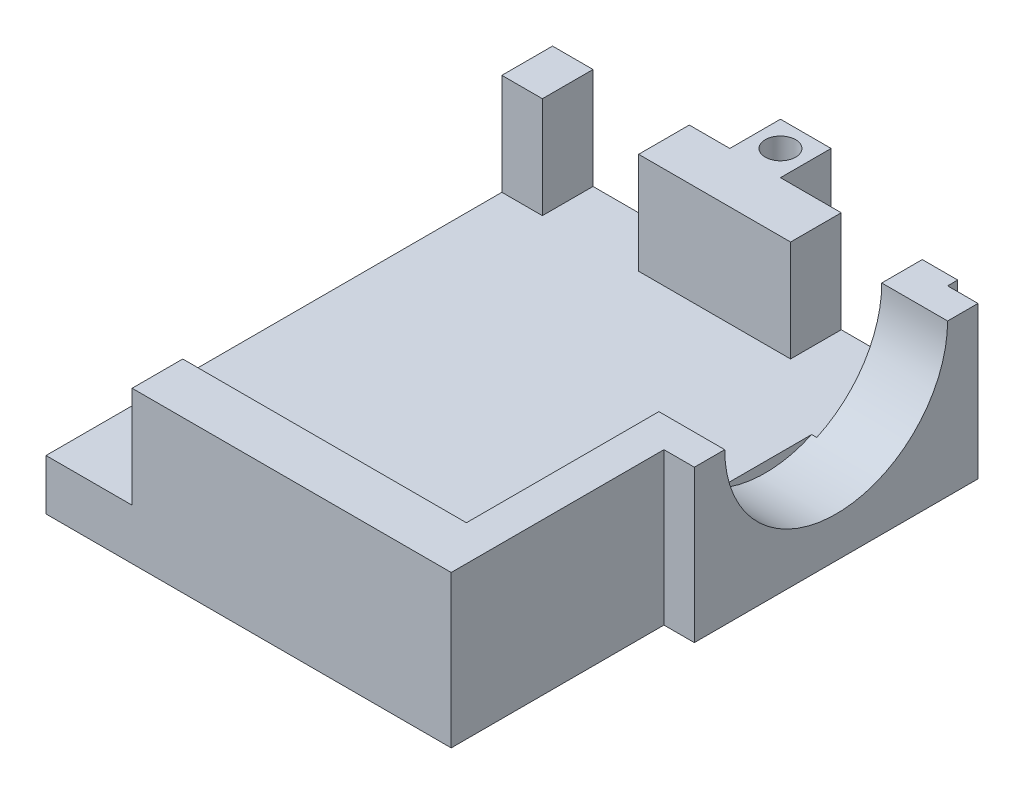
ISO-10303-21;
HEADER;
FILE_DESCRIPTION(('STEP AP214'),'2;1');
FILE_NAME('part.step','',(''),(''),'','','');
FILE_SCHEMA(('AUTOMOTIVE_DESIGN { 1 0 10303 214 1 1 1 1 }'));
ENDSEC;
DATA;
#1=APPLICATION_CONTEXT('core data for automotive mechanical design processes');
#2=APPLICATION_PROTOCOL_DEFINITION('international standard','automotive_design',2000,#1);
#3=PRODUCT_CONTEXT('',#1,'mechanical');
#4=PRODUCT('Part','Part','',(#3));
#5=PRODUCT_RELATED_PRODUCT_CATEGORY('part','',(#4));
#6=PRODUCT_DEFINITION_FORMATION('','',#4);
#7=PRODUCT_DEFINITION_CONTEXT('part definition',#1,'design');
#8=PRODUCT_DEFINITION('design','',#6,#7);
#9=PRODUCT_DEFINITION_SHAPE('','',#8);
#10=(LENGTH_UNIT() NAMED_UNIT(*) SI_UNIT(.MILLI.,.METRE.));
#11=(NAMED_UNIT(*) PLANE_ANGLE_UNIT() SI_UNIT($,.RADIAN.));
#12=(NAMED_UNIT(*) SI_UNIT($,.STERADIAN.) SOLID_ANGLE_UNIT());
#13=UNCERTAINTY_MEASURE_WITH_UNIT(LENGTH_MEASURE(1.E-05),#10,'distance_accuracy_value','');
#14=(GEOMETRIC_REPRESENTATION_CONTEXT(3) GLOBAL_UNCERTAINTY_ASSIGNED_CONTEXT((#13)) GLOBAL_UNIT_ASSIGNED_CONTEXT((#10,
#11,#12)) REPRESENTATION_CONTEXT('',''));
#15=CARTESIAN_POINT('',(0.,0.,0.));
#16=DIRECTION('',(0.,0.,1.));
#17=DIRECTION('',(1.,0.,0.));
#18=AXIS2_PLACEMENT_3D('',#15,#16,#17);
#19=CARTESIAN_POINT('',(-20.,5.,-25.));
#20=DIRECTION('',(0.,0.,1.));
#21=DIRECTION('',(1.,0.,0.));
#22=AXIS2_PLACEMENT_3D('',#19,#20,#21);
#23=PLANE('',#22);
#24=DIRECTION('',(0.,1.,0.));
#25=VECTOR('',#24,1.);
#26=CARTESIAN_POINT('',(-2.5,10.,-25.));
#27=LINE('',#26,#25);
#28=CARTESIAN_POINT('',(-2.5,10.,-25.));
#29=VERTEX_POINT('',#28);
#30=CARTESIAN_POINT('',(-2.5,15.,-25.));
#31=VERTEX_POINT('',#30);
#32=EDGE_CURVE('E116',#29,#31,#27,.T.);
#33=ORIENTED_EDGE('',*,*,#32,.F.);
#34=DIRECTION('',(-1.,0.,0.));
#35=VECTOR('',#34,1.);
#36=CARTESIAN_POINT('',(-2.5,10.,-25.));
#37=LINE('',#36,#35);
#38=CARTESIAN_POINT('',(2.5,10.,-25.));
#39=VERTEX_POINT('',#38);
#40=EDGE_CURVE('E299',#39,#29,#37,.T.);
#41=ORIENTED_EDGE('',*,*,#40,.F.);
#42=DIRECTION('',(0.,-1.,0.));
#43=VECTOR('',#42,1.);
#44=CARTESIAN_POINT('',(2.5,10.,-25.));
#45=LINE('',#44,#43);
#46=CARTESIAN_POINT('',(2.5,15.,-25.));
#47=VERTEX_POINT('',#46);
#48=EDGE_CURVE('E646',#47,#39,#45,.T.);
#49=ORIENTED_EDGE('',*,*,#48,.F.);
#50=DIRECTION('',(-1.,0.,0.));
#51=VECTOR('',#50,1.);
#52=CARTESIAN_POINT('',(0.,15.,-25.));
#53=LINE('',#52,#51);
#54=CARTESIAN_POINT('',(8.5,15.,-25.));
#55=VERTEX_POINT('',#54);
#56=EDGE_CURVE('E411',#55,#47,#53,.T.);
#57=ORIENTED_EDGE('',*,*,#56,.F.);
#58=DIRECTION('',(0.,-1.,0.));
#59=VECTOR('',#58,1.);
#60=CARTESIAN_POINT('',(8.5,15.,-25.));
#61=LINE('',#60,#59);
#62=CARTESIAN_POINT('',(8.5,5.,-25.));
#63=VERTEX_POINT('',#62);
#64=EDGE_CURVE('E365',#55,#63,#61,.T.);
#65=ORIENTED_EDGE('',*,*,#64,.T.);
#66=DIRECTION('',(-1.,0.,0.));
#67=VECTOR('',#66,1.);
#68=CARTESIAN_POINT('',(-20.,5.,-25.));
#69=LINE('',#68,#67);
#70=CARTESIAN_POINT('',(16.5,5.,-25.));
#71=VERTEX_POINT('',#70);
#72=EDGE_CURVE('E445',#71,#63,#69,.T.);
#73=ORIENTED_EDGE('',*,*,#72,.F.);
#74=DIRECTION('',(0.,-1.,0.));
#75=VECTOR('',#74,1.);
#76=CARTESIAN_POINT('',(16.5,15.,-25.));
#77=LINE('',#76,#75);
#78=CARTESIAN_POINT('',(16.5,15.,-25.));
#79=VERTEX_POINT('',#78);
#80=EDGE_CURVE('E351',#79,#71,#77,.T.);
#81=ORIENTED_EDGE('',*,*,#80,.F.);
#82=DIRECTION('',(-1.,0.,0.));
#83=VECTOR('',#82,1.);
#84=CARTESIAN_POINT('',(0.,15.,-25.));
#85=LINE('',#84,#83);
#86=CARTESIAN_POINT('',(20.,15.,-25.));
#87=VERTEX_POINT('',#86);
#88=EDGE_CURVE('E382',#87,#79,#85,.T.);
#89=ORIENTED_EDGE('',*,*,#88,.F.);
#90=DIRECTION('',(0.,-1.,0.));
#91=VECTOR('',#90,1.);
#92=CARTESIAN_POINT('',(20.,5.,-25.));
#93=LINE('',#92,#91);
#94=CARTESIAN_POINT('',(20.,0.,-25.));
#95=VERTEX_POINT('',#94);
#96=EDGE_CURVE('E458',#87,#95,#93,.T.);
#97=ORIENTED_EDGE('',*,*,#96,.T.);
#98=DIRECTION('',(-1.,0.,0.));
#99=VECTOR('',#98,1.);
#100=CARTESIAN_POINT('',(-20.,0.,-25.));
#101=LINE('',#100,#99);
#102=CARTESIAN_POINT('',(-20.,0.,-25.));
#103=VERTEX_POINT('',#102);
#104=EDGE_CURVE('E441',#95,#103,#101,.T.);
#105=ORIENTED_EDGE('',*,*,#104,.T.);
#106=DIRECTION('',(0.,-1.,0.));
#107=VECTOR('',#106,1.);
#108=CARTESIAN_POINT('',(-20.,5.,-25.));
#109=LINE('',#108,#107);
#110=CARTESIAN_POINT('',(-20.,15.,-25.));
#111=VERTEX_POINT('',#110);
#112=EDGE_CURVE('E447',#111,#103,#109,.T.);
#113=ORIENTED_EDGE('',*,*,#112,.F.);
#114=DIRECTION('',(1.,0.,0.));
#115=VECTOR('',#114,1.);
#116=CARTESIAN_POINT('',(-20.,15.,-25.));
#117=LINE('',#116,#115);
#118=CARTESIAN_POINT('',(-16.,15.,-25.));
#119=VERTEX_POINT('',#118);
#120=EDGE_CURVE('E421',#111,#119,#117,.T.);
#121=ORIENTED_EDGE('',*,*,#120,.T.);
#122=DIRECTION('',(0.,-1.,0.));
#123=VECTOR('',#122,1.);
#124=CARTESIAN_POINT('',(-16.,15.,-25.));
#125=LINE('',#124,#123);
#126=CARTESIAN_POINT('',(-16.,5.,-25.));
#127=VERTEX_POINT('',#126);
#128=EDGE_CURVE('E431',#119,#127,#125,.T.);
#129=ORIENTED_EDGE('',*,*,#128,.T.);
#130=CARTESIAN_POINT('',(-6.5,5.,-25.));
#131=VERTEX_POINT('',#130);
#132=EDGE_CURVE('E444',#131,#127,#69,.T.);
#133=ORIENTED_EDGE('',*,*,#132,.F.);
#134=DIRECTION('',(0.,-1.,0.));
#135=VECTOR('',#134,1.);
#136=CARTESIAN_POINT('',(-6.5,15.,-25.));
#137=LINE('',#136,#135);
#138=CARTESIAN_POINT('',(-6.5,15.,-25.));
#139=VERTEX_POINT('',#138);
#140=EDGE_CURVE('E390',#139,#131,#137,.T.);
#141=ORIENTED_EDGE('',*,*,#140,.F.);
#142=EDGE_CURVE('E121',#31,#139,#53,.T.);
#143=ORIENTED_EDGE('',*,*,#142,.F.);
#144=EDGE_LOOP('',(#33,#41,#49,#57,#65,#73,#81,#89,#97,#105,#113,#121,#129,#133,#141,#143));
#145=FACE_BOUND('',#144,.T.);
#146=ADVANCED_FACE('F101',(#145),#23,.F.);
#147=CARTESIAN_POINT('',(20.,5.,-25.));
#148=DIRECTION('',(-1.,0.,0.));
#149=DIRECTION('',(0.,0.,1.));
#150=AXIS2_PLACEMENT_3D('',#147,#148,#149);
#151=PLANE('',#150);
#152=DIRECTION('',(0.,-1.,0.));
#153=VECTOR('',#152,1.);
#154=CARTESIAN_POINT('',(20.,15.,4.00000000000002));
#155=LINE('',#154,#153);
#156=CARTESIAN_POINT('',(20.,15.,4.00000000000002));
#157=VERTEX_POINT('',#156);
#158=CARTESIAN_POINT('',(20.,0.,4.00000000000002));
#159=VERTEX_POINT('',#158);
#160=EDGE_CURVE('E305',#157,#159,#155,.T.);
#161=ORIENTED_EDGE('',*,*,#160,.F.);
#162=DIRECTION('',(0.,0.,-1.));
#163=VECTOR('',#162,1.);
#164=CARTESIAN_POINT('',(20.,15.,0.));
#165=LINE('',#164,#163);
#166=CARTESIAN_POINT('',(20.,15.,25.));
#167=VERTEX_POINT('',#166);
#168=EDGE_CURVE('E385',#167,#157,#165,.T.);
#169=ORIENTED_EDGE('',*,*,#168,.F.);
#170=DIRECTION('',(0.,-1.,0.));
#171=VECTOR('',#170,1.);
#172=CARTESIAN_POINT('',(20.,5.,25.));
#173=LINE('',#172,#171);
#174=CARTESIAN_POINT('',(20.,0.,25.));
#175=VERTEX_POINT('',#174);
#176=EDGE_CURVE('E461',#167,#175,#173,.T.);
#177=ORIENTED_EDGE('',*,*,#176,.T.);
#178=DIRECTION('',(0.,0.,-1.));
#179=VECTOR('',#178,1.);
#180=CARTESIAN_POINT('',(20.,0.,-25.));
#181=LINE('',#180,#179);
#182=EDGE_CURVE('E453',#175,#159,#181,.T.);
#183=ORIENTED_EDGE('',*,*,#182,.T.);
#184=EDGE_LOOP('',(#161,#169,#177,#183));
#185=FACE_BOUND('',#184,.T.);
#186=ADVANCED_FACE('F558',(#185),#151,.F.);
#187=DIRECTION('',(0.,1.,0.));
#188=VECTOR('',#187,1.);
#189=CARTESIAN_POINT('',(20.,0.,-24.));
#190=LINE('',#189,#188);
#191=CARTESIAN_POINT('',(20.,0.,-24.));
#192=VERTEX_POINT('',#191);
#193=CARTESIAN_POINT('',(20.,15.,-24.));
#194=VERTEX_POINT('',#193);
#195=EDGE_CURVE('E302',#192,#194,#190,.T.);
#196=ORIENTED_EDGE('',*,*,#195,.F.);
#197=EDGE_CURVE('E452',#192,#95,#181,.T.);
#198=ORIENTED_EDGE('',*,*,#197,.T.);
#199=ORIENTED_EDGE('',*,*,#96,.F.);
#200=EDGE_CURVE('E384',#194,#87,#165,.T.);
#201=ORIENTED_EDGE('',*,*,#200,.F.);
#202=EDGE_LOOP('',(#196,#198,#199,#201));
#203=FACE_BOUND('',#202,.T.);
#204=ADVANCED_FACE('F562',(#203),#151,.F.);
#205=CARTESIAN_POINT('',(16.5,15.,0.));
#206=DIRECTION('',(1.,0.,0.));
#207=DIRECTION('',(0.,0.,-1.));
#208=AXIS2_PLACEMENT_3D('',#205,#206,#207);
#209=PLANE('',#208);
#210=DIRECTION('',(0.,0.,1.));
#211=VECTOR('',#210,1.);
#212=CARTESIAN_POINT('',(16.5,15.,0.));
#213=LINE('',#212,#211);
#214=CARTESIAN_POINT('',(16.5,15.,1.00000000000002));
#215=VERTEX_POINT('',#214);
#216=CARTESIAN_POINT('',(16.5,15.,20.));
#217=VERTEX_POINT('',#216);
#218=EDGE_CURVE('E375',#215,#217,#213,.T.);
#219=ORIENTED_EDGE('',*,*,#218,.F.);
#220=CARTESIAN_POINT('',(16.5,15.,-9.99999999999998));
#221=DIRECTION('',(1.,0.,0.));
#222=DIRECTION('',(0.,0.,-1.));
#223=AXIS2_PLACEMENT_3D('',#220,#221,#222);
#224=CIRCLE('',#223,11.);
#225=CARTESIAN_POINT('',(16.5,5.,-5.41742430504414));
#226=VERTEX_POINT('',#225);
#227=EDGE_CURVE('E347',#215,#226,#224,.T.);
#228=ORIENTED_EDGE('',*,*,#227,.T.);
#229=DIRECTION('',(0.,0.,1.));
#230=VECTOR('',#229,1.);
#231=CARTESIAN_POINT('',(16.5,5.,0.));
#232=LINE('',#231,#230);
#233=CARTESIAN_POINT('',(16.5,5.,20.));
#234=VERTEX_POINT('',#233);
#235=EDGE_CURVE('E378',#226,#234,#232,.T.);
#236=ORIENTED_EDGE('',*,*,#235,.T.);
#237=DIRECTION('',(0.,-1.,0.));
#238=VECTOR('',#237,1.);
#239=CARTESIAN_POINT('',(16.5,15.,20.));
#240=LINE('',#239,#238);
#241=EDGE_CURVE('E372',#217,#234,#240,.T.);
#242=ORIENTED_EDGE('',*,*,#241,.F.);
#243=EDGE_LOOP('',(#219,#228,#236,#242));
#244=FACE_BOUND('',#243,.T.);
#245=ADVANCED_FACE('F556',(#244),#209,.F.);
#246=CARTESIAN_POINT('',(0.,15.,0.));
#247=DIRECTION('',(0.,1.,0.));
#248=DIRECTION('',(0.,0.,1.));
#249=AXIS2_PLACEMENT_3D('',#246,#247,#248);
#250=PLANE('',#249);
#251=DIRECTION('',(1.,0.,0.));
#252=VECTOR('',#251,1.);
#253=CARTESIAN_POINT('',(16.,15.,1.00000000000002));
#254=LINE('',#253,#252);
#255=CARTESIAN_POINT('',(23.,15.,1.00000000000003));
#256=VERTEX_POINT('',#255);
#257=EDGE_CURVE('E109',#215,#256,#254,.T.);
#258=ORIENTED_EDGE('',*,*,#257,.F.);
#259=ORIENTED_EDGE('',*,*,#218,.T.);
#260=DIRECTION('',(-1.,0.,0.));
#261=VECTOR('',#260,1.);
#262=CARTESIAN_POINT('',(-6.49999999999999,15.,20.));
#263=LINE('',#262,#261);
#264=CARTESIAN_POINT('',(-11.5,15.,20.));
#265=VERTEX_POINT('',#264);
#266=EDGE_CURVE('E354',#217,#265,#263,.T.);
#267=ORIENTED_EDGE('',*,*,#266,.T.);
#268=DIRECTION('',(0.,0.,1.));
#269=VECTOR('',#268,1.);
#270=CARTESIAN_POINT('',(-11.5,15.,20.));
#271=LINE('',#270,#269);
#272=CARTESIAN_POINT('',(-11.5,15.,25.));
#273=VERTEX_POINT('',#272);
#274=EDGE_CURVE('E367',#265,#273,#271,.T.);
#275=ORIENTED_EDGE('',*,*,#274,.T.);
#276=DIRECTION('',(-1.,0.,0.));
#277=VECTOR('',#276,1.);
#278=CARTESIAN_POINT('',(-6.49999999999999,15.,25.));
#279=LINE('',#278,#277);
#280=EDGE_CURVE('E362',#167,#273,#279,.T.);
#281=ORIENTED_EDGE('',*,*,#280,.F.);
#282=ORIENTED_EDGE('',*,*,#168,.T.);
#283=DIRECTION('',(-1.,0.,0.));
#284=VECTOR('',#283,1.);
#285=CARTESIAN_POINT('',(23.,15.,4.00000000000002));
#286=LINE('',#285,#284);
#287=CARTESIAN_POINT('',(23.,15.,4.00000000000002));
#288=VERTEX_POINT('',#287);
#289=EDGE_CURVE('E331',#288,#157,#286,.T.);
#290=ORIENTED_EDGE('',*,*,#289,.F.);
#291=DIRECTION('',(0.,0.,1.));
#292=VECTOR('',#291,1.);
#293=CARTESIAN_POINT('',(23.,15.,1.00000000000003));
#294=LINE('',#293,#292);
#295=EDGE_CURVE('E322',#256,#288,#294,.T.);
#296=ORIENTED_EDGE('',*,*,#295,.F.);
#297=EDGE_LOOP('',(#258,#259,#267,#275,#281,#282,#290,#296));
#298=FACE_BOUND('',#297,.T.);
#299=ADVANCED_FACE('F480',(#298),#250,.T.);
#300=CARTESIAN_POINT('',(0.,5.,0.));
#301=DIRECTION('',(0.,1.,0.));
#302=DIRECTION('',(0.,0.,1.));
#303=AXIS2_PLACEMENT_3D('',#300,#301,#302);
#304=PLANE('',#303);
#305=DIRECTION('',(1.,0.,0.));
#306=VECTOR('',#305,1.);
#307=CARTESIAN_POINT('',(16.,5.,-5.41742430504414));
#308=LINE('',#307,#306);
#309=CARTESIAN_POINT('',(16.,5.,-5.41742430504414));
#310=VERTEX_POINT('',#309);
#311=EDGE_CURVE('E349',#310,#226,#308,.T.);
#312=ORIENTED_EDGE('',*,*,#311,.F.);
#313=DIRECTION('',(0.,0.,-1.));
#314=VECTOR('',#313,1.);
#315=CARTESIAN_POINT('',(16.,5.,0.));
#316=LINE('',#315,#314);
#317=CARTESIAN_POINT('',(16.,5.,-14.5825756949558));
#318=VERTEX_POINT('',#317);
#319=EDGE_CURVE('E12',#310,#318,#316,.T.);
#320=ORIENTED_EDGE('',*,*,#319,.T.);
#321=DIRECTION('',(1.,0.,0.));
#322=VECTOR('',#321,1.);
#323=CARTESIAN_POINT('',(16.,5.,-14.5825756949558));
#324=LINE('',#323,#322);
#325=CARTESIAN_POINT('',(16.5,5.,-14.5825756949558));
#326=VERTEX_POINT('',#325);
#327=EDGE_CURVE('E346',#326,#318,#324,.F.);
#328=ORIENTED_EDGE('',*,*,#327,.F.);
#329=EDGE_CURVE('E357',#71,#326,#232,.T.);
#330=ORIENTED_EDGE('',*,*,#329,.F.);
#331=ORIENTED_EDGE('',*,*,#72,.T.);
#332=DIRECTION('',(0.,0.,1.));
#333=VECTOR('',#332,1.);
#334=CARTESIAN_POINT('',(8.5,5.,0.));
#335=LINE('',#334,#333);
#336=CARTESIAN_POINT('',(8.5,5.,-20.));
#337=VERTEX_POINT('',#336);
#338=EDGE_CURVE('E404',#63,#337,#335,.T.);
#339=ORIENTED_EDGE('',*,*,#338,.T.);
#340=DIRECTION('',(1.,0.,0.));
#341=VECTOR('',#340,1.);
#342=CARTESIAN_POINT('',(0.,5.,-20.));
#343=LINE('',#342,#341);
#344=CARTESIAN_POINT('',(-6.5,5.,-20.));
#345=VERTEX_POINT('',#344);
#346=EDGE_CURVE('E397',#345,#337,#343,.T.);
#347=ORIENTED_EDGE('',*,*,#346,.F.);
#348=DIRECTION('',(0.,0.,1.));
#349=VECTOR('',#348,1.);
#350=CARTESIAN_POINT('',(-6.49999999999999,5.,0.));
#351=LINE('',#350,#349);
#352=EDGE_CURVE('E400',#131,#345,#351,.T.);
#353=ORIENTED_EDGE('',*,*,#352,.F.);
#354=ORIENTED_EDGE('',*,*,#132,.T.);
#355=DIRECTION('',(0.,0.,1.));
#356=VECTOR('',#355,1.);
#357=CARTESIAN_POINT('',(-16.,5.,-25.));
#358=LINE('',#357,#356);
#359=CARTESIAN_POINT('',(-16.,5.,-20.));
#360=VERTEX_POINT('',#359);
#361=EDGE_CURVE('E418',#127,#360,#358,.T.);
#362=ORIENTED_EDGE('',*,*,#361,.T.);
#363=DIRECTION('',(1.,0.,0.));
#364=VECTOR('',#363,1.);
#365=CARTESIAN_POINT('',(-20.,5.,-20.));
#366=LINE('',#365,#364);
#367=CARTESIAN_POINT('',(-20.,5.,-20.));
#368=VERTEX_POINT('',#367);
#369=EDGE_CURVE('E407',#368,#360,#366,.T.);
#370=ORIENTED_EDGE('',*,*,#369,.F.);
#371=DIRECTION('',(0.,0.,1.));
#372=VECTOR('',#371,1.);
#373=CARTESIAN_POINT('',(-20.,5.,-25.));
#374=LINE('',#373,#372);
#375=CARTESIAN_POINT('',(-20.,5.,25.));
#376=VERTEX_POINT('',#375);
#377=EDGE_CURVE('E438',#368,#376,#374,.T.);
#378=ORIENTED_EDGE('',*,*,#377,.T.);
#379=DIRECTION('',(1.,0.,0.));
#380=VECTOR('',#379,1.);
#381=CARTESIAN_POINT('',(-20.,5.,25.));
#382=LINE('',#381,#380);
#383=CARTESIAN_POINT('',(-11.5,5.,25.));
#384=VERTEX_POINT('',#383);
#385=EDGE_CURVE('E440',#376,#384,#382,.T.);
#386=ORIENTED_EDGE('',*,*,#385,.T.);
#387=DIRECTION('',(0.,0.,1.));
#388=VECTOR('',#387,1.);
#389=CARTESIAN_POINT('',(-11.5,5.,20.));
#390=LINE('',#389,#388);
#391=CARTESIAN_POINT('',(-11.5,5.,20.));
#392=VERTEX_POINT('',#391);
#393=EDGE_CURVE('E361',#392,#384,#390,.T.);
#394=ORIENTED_EDGE('',*,*,#393,.F.);
#395=DIRECTION('',(-1.,0.,0.));
#396=VECTOR('',#395,1.);
#397=CARTESIAN_POINT('',(-6.49999999999999,5.,20.));
#398=LINE('',#397,#396);
#399=EDGE_CURVE('E358',#234,#392,#398,.T.);
#400=ORIENTED_EDGE('',*,*,#399,.F.);
#401=ORIENTED_EDGE('',*,*,#235,.F.);
#402=EDGE_LOOP('',(#312,#320,#328,#330,#331,#339,#347,#353,#354,#362,#370,#378,#386,#394,#400,#401));
#403=FACE_BOUND('',#402,.T.);
#404=ADVANCED_FACE('F508',(#403),#304,.T.);
#405=CARTESIAN_POINT('',(-20.,5.,-25.));
#406=DIRECTION('',(1.,0.,0.));
#407=DIRECTION('',(0.,0.,-1.));
#408=AXIS2_PLACEMENT_3D('',#405,#406,#407);
#409=PLANE('',#408);
#410=DIRECTION('',(0.,0.,1.));
#411=VECTOR('',#410,1.);
#412=CARTESIAN_POINT('',(-20.,0.,-25.));
#413=LINE('',#412,#411);
#414=CARTESIAN_POINT('',(-20.,0.,25.));
#415=VERTEX_POINT('',#414);
#416=EDGE_CURVE('E437',#103,#415,#413,.T.);
#417=ORIENTED_EDGE('',*,*,#416,.T.);
#418=DIRECTION('',(0.,-1.,0.));
#419=VECTOR('',#418,1.);
#420=CARTESIAN_POINT('',(-20.,5.,25.));
#421=LINE('',#420,#419);
#422=EDGE_CURVE('E464',#376,#415,#421,.T.);
#423=ORIENTED_EDGE('',*,*,#422,.F.);
#424=ORIENTED_EDGE('',*,*,#377,.F.);
#425=DIRECTION('',(0.,-1.,0.));
#426=VECTOR('',#425,1.);
#427=CARTESIAN_POINT('',(-20.,15.,-20.));
#428=LINE('',#427,#426);
#429=CARTESIAN_POINT('',(-20.,15.,-20.));
#430=VERTEX_POINT('',#429);
#431=EDGE_CURVE('E426',#430,#368,#428,.T.);
#432=ORIENTED_EDGE('',*,*,#431,.F.);
#433=DIRECTION('',(0.,0.,1.));
#434=VECTOR('',#433,1.);
#435=CARTESIAN_POINT('',(-20.,15.,-25.));
#436=LINE('',#435,#434);
#437=EDGE_CURVE('E424',#111,#430,#436,.T.);
#438=ORIENTED_EDGE('',*,*,#437,.F.);
#439=ORIENTED_EDGE('',*,*,#112,.T.);
#440=EDGE_LOOP('',(#417,#423,#424,#432,#438,#439));
#441=FACE_BOUND('',#440,.T.);
#442=ADVANCED_FACE('F103',(#441),#409,.F.);
#443=CARTESIAN_POINT('',(-20.,5.,25.));
#444=DIRECTION('',(0.,0.,-1.));
#445=DIRECTION('',(-1.,0.,0.));
#446=AXIS2_PLACEMENT_3D('',#443,#444,#445);
#447=PLANE('',#446);
#448=DIRECTION('',(1.,0.,0.));
#449=VECTOR('',#448,1.);
#450=CARTESIAN_POINT('',(-20.,0.,25.));
#451=LINE('',#450,#449);
#452=EDGE_CURVE('E450',#415,#175,#451,.T.);
#453=ORIENTED_EDGE('',*,*,#452,.T.);
#454=ORIENTED_EDGE('',*,*,#176,.F.);
#455=ORIENTED_EDGE('',*,*,#280,.T.);
#456=DIRECTION('',(0.,-1.,0.));
#457=VECTOR('',#456,1.);
#458=CARTESIAN_POINT('',(-11.5,15.,25.));
#459=LINE('',#458,#457);
#460=EDGE_CURVE('E352',#273,#384,#459,.T.);
#461=ORIENTED_EDGE('',*,*,#460,.T.);
#462=ORIENTED_EDGE('',*,*,#385,.F.);
#463=ORIENTED_EDGE('',*,*,#422,.T.);
#464=EDGE_LOOP('',(#453,#454,#455,#461,#462,#463));
#465=FACE_BOUND('',#464,.T.);
#466=ADVANCED_FACE('F543',(#465),#447,.F.);
#467=CARTESIAN_POINT('',(0.,0.,0.));
#468=DIRECTION('',(0.,1.,0.));
#469=DIRECTION('',(0.,0.,1.));
#470=AXIS2_PLACEMENT_3D('',#467,#468,#469);
#471=PLANE('',#470);
#472=ORIENTED_EDGE('',*,*,#416,.F.);
#473=ORIENTED_EDGE('',*,*,#104,.F.);
#474=ORIENTED_EDGE('',*,*,#197,.F.);
#475=DIRECTION('',(-1.,0.,0.));
#476=VECTOR('',#475,1.);
#477=CARTESIAN_POINT('',(23.,0.,-24.));
#478=LINE('',#477,#476);
#479=CARTESIAN_POINT('',(23.,0.,-24.));
#480=VERTEX_POINT('',#479);
#481=EDGE_CURVE('E337',#480,#192,#478,.T.);
#482=ORIENTED_EDGE('',*,*,#481,.F.);
#483=DIRECTION('',(0.,0.,-1.));
#484=VECTOR('',#483,1.);
#485=CARTESIAN_POINT('',(23.,0.,4.00000000000002));
#486=LINE('',#485,#484);
#487=CARTESIAN_POINT('',(23.,0.,4.00000000000002));
#488=VERTEX_POINT('',#487);
#489=EDGE_CURVE('E311',#488,#480,#486,.T.);
#490=ORIENTED_EDGE('',*,*,#489,.F.);
#491=DIRECTION('',(-1.,0.,0.));
#492=VECTOR('',#491,1.);
#493=CARTESIAN_POINT('',(23.,0.,4.00000000000002));
#494=LINE('',#493,#492);
#495=EDGE_CURVE('E325',#488,#159,#494,.T.);
#496=ORIENTED_EDGE('',*,*,#495,.T.);
#497=ORIENTED_EDGE('',*,*,#182,.F.);
#498=ORIENTED_EDGE('',*,*,#452,.F.);
#499=EDGE_LOOP('',(#472,#473,#474,#482,#490,#496,#497,#498));
#500=FACE_BOUND('',#499,.T.);
#501=ADVANCED_FACE('F493',(#500),#471,.F.);
#502=CARTESIAN_POINT('',(-20.,15.,-20.));
#503=DIRECTION('',(0.,0.,-1.));
#504=DIRECTION('',(-1.,0.,0.));
#505=AXIS2_PLACEMENT_3D('',#502,#503,#504);
#506=PLANE('',#505);
#507=ORIENTED_EDGE('',*,*,#369,.T.);
#508=DIRECTION('',(0.,-1.,0.));
#509=VECTOR('',#508,1.);
#510=CARTESIAN_POINT('',(-16.,15.,-20.));
#511=LINE('',#510,#509);
#512=CARTESIAN_POINT('',(-16.,15.,-20.));
#513=VERTEX_POINT('',#512);
#514=EDGE_CURVE('E434',#513,#360,#511,.T.);
#515=ORIENTED_EDGE('',*,*,#514,.F.);
#516=DIRECTION('',(1.,0.,0.));
#517=VECTOR('',#516,1.);
#518=CARTESIAN_POINT('',(-20.,15.,-20.));
#519=LINE('',#518,#517);
#520=EDGE_CURVE('E415',#430,#513,#519,.T.);
#521=ORIENTED_EDGE('',*,*,#520,.F.);
#522=ORIENTED_EDGE('',*,*,#431,.T.);
#523=EDGE_LOOP('',(#507,#515,#521,#522));
#524=FACE_BOUND('',#523,.T.);
#525=ADVANCED_FACE('F534',(#524),#506,.F.);
#526=CARTESIAN_POINT('',(-16.,15.,-25.));
#527=DIRECTION('',(1.,0.,0.));
#528=DIRECTION('',(0.,0.,-1.));
#529=AXIS2_PLACEMENT_3D('',#526,#527,#528);
#530=PLANE('',#529);
#531=ORIENTED_EDGE('',*,*,#361,.F.);
#532=ORIENTED_EDGE('',*,*,#128,.F.);
#533=DIRECTION('',(0.,0.,1.));
#534=VECTOR('',#533,1.);
#535=CARTESIAN_POINT('',(-16.,15.,-25.));
#536=LINE('',#535,#534);
#537=EDGE_CURVE('E417',#119,#513,#536,.T.);
#538=ORIENTED_EDGE('',*,*,#537,.T.);
#539=ORIENTED_EDGE('',*,*,#514,.T.);
#540=EDGE_LOOP('',(#531,#532,#538,#539));
#541=FACE_BOUND('',#540,.T.);
#542=ADVANCED_FACE('F529',(#541),#530,.T.);
#543=CARTESIAN_POINT('',(0.,15.,0.));
#544=DIRECTION('',(0.,-1.,0.));
#545=DIRECTION('',(0.,0.,-1.));
#546=AXIS2_PLACEMENT_3D('',#543,#544,#545);
#547=PLANE('',#546);
#548=ORIENTED_EDGE('',*,*,#520,.T.);
#549=ORIENTED_EDGE('',*,*,#537,.F.);
#550=ORIENTED_EDGE('',*,*,#120,.F.);
#551=ORIENTED_EDGE('',*,*,#437,.T.);
#552=EDGE_LOOP('',(#548,#549,#550,#551));
#553=FACE_BOUND('',#552,.T.);
#554=ADVANCED_FACE('F583',(#553),#547,.F.);
#555=CARTESIAN_POINT('',(8.5,15.,0.));
#556=DIRECTION('',(1.,0.,0.));
#557=DIRECTION('',(0.,0.,-1.));
#558=AXIS2_PLACEMENT_3D('',#555,#556,#557);
#559=PLANE('',#558);
#560=ORIENTED_EDGE('',*,*,#338,.F.);
#561=ORIENTED_EDGE('',*,*,#64,.F.);
#562=DIRECTION('',(0.,0.,1.));
#563=VECTOR('',#562,1.);
#564=CARTESIAN_POINT('',(8.5,15.,0.));
#565=LINE('',#564,#563);
#566=CARTESIAN_POINT('',(8.5,15.,-20.));
#567=VERTEX_POINT('',#566);
#568=EDGE_CURVE('E401',#55,#567,#565,.T.);
#569=ORIENTED_EDGE('',*,*,#568,.T.);
#570=DIRECTION('',(0.,-1.,0.));
#571=VECTOR('',#570,1.);
#572=CARTESIAN_POINT('',(8.5,15.,-20.));
#573=LINE('',#572,#571);
#574=EDGE_CURVE('E394',#567,#337,#573,.T.);
#575=ORIENTED_EDGE('',*,*,#574,.T.);
#576=EDGE_LOOP('',(#560,#561,#569,#575));
#577=FACE_BOUND('',#576,.T.);
#578=ADVANCED_FACE('F513',(#577),#559,.T.);
#579=CARTESIAN_POINT('',(-6.49999999999999,15.,0.));
#580=DIRECTION('',(1.,0.,0.));
#581=DIRECTION('',(0.,0.,-1.));
#582=AXIS2_PLACEMENT_3D('',#579,#580,#581);
#583=PLANE('',#582);
#584=ORIENTED_EDGE('',*,*,#352,.T.);
#585=DIRECTION('',(0.,-1.,0.));
#586=VECTOR('',#585,1.);
#587=CARTESIAN_POINT('',(-6.5,15.,-20.));
#588=LINE('',#587,#586);
#589=CARTESIAN_POINT('',(-6.5,15.,-20.));
#590=VERTEX_POINT('',#589);
#591=EDGE_CURVE('E392',#590,#345,#588,.T.);
#592=ORIENTED_EDGE('',*,*,#591,.F.);
#593=DIRECTION('',(0.,0.,1.));
#594=VECTOR('',#593,1.);
#595=CARTESIAN_POINT('',(-6.49999999999999,15.,0.));
#596=LINE('',#595,#594);
#597=EDGE_CURVE('E409',#139,#590,#596,.T.);
#598=ORIENTED_EDGE('',*,*,#597,.F.);
#599=ORIENTED_EDGE('',*,*,#140,.T.);
#600=EDGE_LOOP('',(#584,#592,#598,#599));
#601=FACE_BOUND('',#600,.T.);
#602=ADVANCED_FACE('F524',(#601),#583,.F.);
#603=CARTESIAN_POINT('',(0.,15.,-20.));
#604=DIRECTION('',(0.,0.,-1.));
#605=DIRECTION('',(-1.,0.,0.));
#606=AXIS2_PLACEMENT_3D('',#603,#604,#605);
#607=PLANE('',#606);
#608=ORIENTED_EDGE('',*,*,#346,.T.);
#609=ORIENTED_EDGE('',*,*,#574,.F.);
#610=DIRECTION('',(1.,0.,0.));
#611=VECTOR('',#610,1.);
#612=CARTESIAN_POINT('',(0.,15.,-20.));
#613=LINE('',#612,#611);
#614=EDGE_CURVE('E396',#590,#567,#613,.T.);
#615=ORIENTED_EDGE('',*,*,#614,.F.);
#616=ORIENTED_EDGE('',*,*,#591,.T.);
#617=EDGE_LOOP('',(#608,#609,#615,#616));
#618=FACE_BOUND('',#617,.T.);
#619=ADVANCED_FACE('F519',(#618),#607,.F.);
#620=CARTESIAN_POINT('',(0.,15.,0.));
#621=DIRECTION('',(0.,1.,0.));
#622=DIRECTION('',(0.,0.,1.));
#623=AXIS2_PLACEMENT_3D('',#620,#621,#622);
#624=PLANE('',#623);
#625=CARTESIAN_POINT('',(0.,15.,-27.5));
#626=DIRECTION('',(0.,-1.,0.));
#627=DIRECTION('',(0.,0.,-1.));
#628=AXIS2_PLACEMENT_3D('',#625,#626,#627);
#629=CIRCLE('',#628,1.5);
#630=CARTESIAN_POINT('',(0.,15.,-29.));
#631=VERTEX_POINT('',#630);
#632=EDGE_CURVE('E635',#631,#631,#629,.T.);
#633=ORIENTED_EDGE('',*,*,#632,.T.);
#634=EDGE_LOOP('',(#633));
#635=FACE_BOUND('',#634,.T.);
#636=ORIENTED_EDGE('',*,*,#568,.F.);
#637=ORIENTED_EDGE('',*,*,#56,.T.);
#638=DIRECTION('',(0.,0.,1.));
#639=VECTOR('',#638,1.);
#640=CARTESIAN_POINT('',(2.5,15.,-30.));
#641=LINE('',#640,#639);
#642=CARTESIAN_POINT('',(2.5,15.,-30.));
#643=VERTEX_POINT('',#642);
#644=EDGE_CURVE('E286',#643,#47,#641,.T.);
#645=ORIENTED_EDGE('',*,*,#644,.F.);
#646=DIRECTION('',(1.,0.,0.));
#647=VECTOR('',#646,1.);
#648=CARTESIAN_POINT('',(-2.5,15.,-30.));
#649=LINE('',#648,#647);
#650=CARTESIAN_POINT('',(-2.5,15.,-30.));
#651=VERTEX_POINT('',#650);
#652=EDGE_CURVE('E278',#651,#643,#649,.T.);
#653=ORIENTED_EDGE('',*,*,#652,.F.);
#654=DIRECTION('',(0.,0.,1.));
#655=VECTOR('',#654,1.);
#656=CARTESIAN_POINT('',(-2.5,15.,-30.));
#657=LINE('',#656,#655);
#658=EDGE_CURVE('E283',#651,#31,#657,.T.);
#659=ORIENTED_EDGE('',*,*,#658,.T.);
#660=ORIENTED_EDGE('',*,*,#142,.T.);
#661=ORIENTED_EDGE('',*,*,#597,.T.);
#662=ORIENTED_EDGE('',*,*,#614,.T.);
#663=EDGE_LOOP('',(#636,#637,#645,#653,#659,#660,#661,#662));
#664=FACE_BOUND('',#663,.T.);
#665=ADVANCED_FACE('F281',(#635,#664),#624,.T.);
#666=ORIENTED_EDGE('',*,*,#329,.T.);
#667=CARTESIAN_POINT('',(16.5,15.,-21.));
#668=VERTEX_POINT('',#667);
#669=EDGE_CURVE('E343',#326,#668,#224,.T.);
#670=ORIENTED_EDGE('',*,*,#669,.T.);
#671=EDGE_CURVE('E379',#79,#668,#213,.T.);
#672=ORIENTED_EDGE('',*,*,#671,.F.);
#673=ORIENTED_EDGE('',*,*,#80,.T.);
#674=EDGE_LOOP('',(#666,#670,#672,#673));
#675=FACE_BOUND('',#674,.T.);
#676=ADVANCED_FACE('F502',(#675),#209,.F.);
#677=CARTESIAN_POINT('',(0.,15.,20.));
#678=DIRECTION('',(0.,0.,1.));
#679=DIRECTION('',(1.,0.,0.));
#680=AXIS2_PLACEMENT_3D('',#677,#678,#679);
#681=PLANE('',#680);
#682=ORIENTED_EDGE('',*,*,#241,.T.);
#683=ORIENTED_EDGE('',*,*,#399,.T.);
#684=DIRECTION('',(0.,-1.,0.));
#685=VECTOR('',#684,1.);
#686=CARTESIAN_POINT('',(-11.5,15.,20.));
#687=LINE('',#686,#685);
#688=EDGE_CURVE('E355',#265,#392,#687,.T.);
#689=ORIENTED_EDGE('',*,*,#688,.F.);
#690=ORIENTED_EDGE('',*,*,#266,.F.);
#691=EDGE_LOOP('',(#682,#683,#689,#690));
#692=FACE_BOUND('',#691,.T.);
#693=ADVANCED_FACE('F552',(#692),#681,.F.);
#694=DIRECTION('',(1.,0.,0.));
#695=VECTOR('',#694,1.);
#696=CARTESIAN_POINT('',(16.,15.,-21.));
#697=LINE('',#696,#695);
#698=CARTESIAN_POINT('',(23.,15.,-21.));
#699=VERTEX_POINT('',#698);
#700=EDGE_CURVE('E467',#699,#668,#697,.F.);
#701=ORIENTED_EDGE('',*,*,#700,.F.);
#702=DIRECTION('',(0.,0.,1.));
#703=VECTOR('',#702,1.);
#704=CARTESIAN_POINT('',(23.,15.,-24.));
#705=LINE('',#704,#703);
#706=CARTESIAN_POINT('',(23.,15.,-24.));
#707=VERTEX_POINT('',#706);
#708=EDGE_CURVE('E316',#707,#699,#705,.T.);
#709=ORIENTED_EDGE('',*,*,#708,.F.);
#710=DIRECTION('',(-1.,0.,0.));
#711=VECTOR('',#710,1.);
#712=CARTESIAN_POINT('',(23.,15.,-24.));
#713=LINE('',#712,#711);
#714=EDGE_CURVE('E334',#707,#194,#713,.T.);
#715=ORIENTED_EDGE('',*,*,#714,.T.);
#716=ORIENTED_EDGE('',*,*,#200,.T.);
#717=ORIENTED_EDGE('',*,*,#88,.T.);
#718=ORIENTED_EDGE('',*,*,#671,.T.);
#719=EDGE_LOOP('',(#701,#709,#715,#716,#717,#718));
#720=FACE_BOUND('',#719,.T.);
#721=ADVANCED_FACE('F498',(#720),#250,.T.);
#722=CARTESIAN_POINT('',(-11.5,15.,20.));
#723=DIRECTION('',(1.,0.,0.));
#724=DIRECTION('',(0.,0.,-1.));
#725=AXIS2_PLACEMENT_3D('',#722,#723,#724);
#726=PLANE('',#725);
#727=ORIENTED_EDGE('',*,*,#393,.T.);
#728=ORIENTED_EDGE('',*,*,#460,.F.);
#729=ORIENTED_EDGE('',*,*,#274,.F.);
#730=ORIENTED_EDGE('',*,*,#688,.T.);
#731=EDGE_LOOP('',(#727,#728,#729,#730));
#732=FACE_BOUND('',#731,.T.);
#733=ADVANCED_FACE('F547',(#732),#726,.F.);
#734=CARTESIAN_POINT('',(16.,15.,-9.99999999999998));
#735=DIRECTION('',(1.,0.,0.));
#736=DIRECTION('',(0.,0.,-1.));
#737=AXIS2_PLACEMENT_3D('',#734,#735,#736);
#738=CYLINDRICAL_SURFACE('',#737,11.);
#739=ORIENTED_EDGE('',*,*,#311,.T.);
#740=ORIENTED_EDGE('',*,*,#227,.F.);
#741=ORIENTED_EDGE('',*,*,#257,.T.);
#742=CARTESIAN_POINT('',(23.,15.,-9.99999999999998));
#743=DIRECTION('',(-1.,0.,0.));
#744=DIRECTION('',(0.,0.,-1.));
#745=AXIS2_PLACEMENT_3D('',#742,#743,#744);
#746=CIRCLE('',#745,11.);
#747=EDGE_CURVE('E319',#699,#256,#746,.T.);
#748=ORIENTED_EDGE('',*,*,#747,.F.);
#749=ORIENTED_EDGE('',*,*,#700,.T.);
#750=ORIENTED_EDGE('',*,*,#669,.F.);
#751=ORIENTED_EDGE('',*,*,#327,.T.);
#752=CARTESIAN_POINT('',(16.,15.,-9.99999999999998));
#753=DIRECTION('',(1.,0.,0.));
#754=DIRECTION('',(0.,0.,-1.));
#755=AXIS2_PLACEMENT_3D('',#752,#753,#754);
#756=CIRCLE('',#755,11.);
#757=EDGE_CURVE('E340',#310,#318,#756,.T.);
#758=ORIENTED_EDGE('',*,*,#757,.F.);
#759=EDGE_LOOP('',(#739,#740,#741,#748,#749,#750,#751,#758));
#760=FACE_BOUND('',#759,.T.);
#761=ADVANCED_FACE('F471',(#760),#738,.F.);
#762=CARTESIAN_POINT('',(16.,15.,-9.99999999999998));
#763=DIRECTION('',(1.,0.,0.));
#764=DIRECTION('',(0.,0.,-1.));
#765=AXIS2_PLACEMENT_3D('',#762,#763,#764);
#766=PLANE('',#765);
#767=ORIENTED_EDGE('',*,*,#757,.T.);
#768=ORIENTED_EDGE('',*,*,#319,.F.);
#769=EDGE_LOOP('',(#767,#768));
#770=FACE_BOUND('',#769,.T.);
#771=ADVANCED_FACE('F605',(#770),#766,.T.);
#772=CARTESIAN_POINT('',(23.,0.,-24.));
#773=DIRECTION('',(0.,0.,1.));
#774=DIRECTION('',(1.,0.,0.));
#775=AXIS2_PLACEMENT_3D('',#772,#773,#774);
#776=PLANE('',#775);
#777=ORIENTED_EDGE('',*,*,#195,.T.);
#778=ORIENTED_EDGE('',*,*,#714,.F.);
#779=DIRECTION('',(0.,1.,0.));
#780=VECTOR('',#779,1.);
#781=CARTESIAN_POINT('',(23.,0.,-24.));
#782=LINE('',#781,#780);
#783=EDGE_CURVE('E314',#480,#707,#782,.T.);
#784=ORIENTED_EDGE('',*,*,#783,.F.);
#785=ORIENTED_EDGE('',*,*,#481,.T.);
#786=EDGE_LOOP('',(#777,#778,#784,#785));
#787=FACE_BOUND('',#786,.T.);
#788=ADVANCED_FACE('F496',(#787),#776,.F.);
#789=CARTESIAN_POINT('',(23.,15.,4.00000000000002));
#790=DIRECTION('',(0.,0.,-1.));
#791=DIRECTION('',(0.,1.,0.));
#792=AXIS2_PLACEMENT_3D('',#789,#790,#791);
#793=PLANE('',#792);
#794=ORIENTED_EDGE('',*,*,#160,.T.);
#795=ORIENTED_EDGE('',*,*,#495,.F.);
#796=DIRECTION('',(0.,-1.,0.));
#797=VECTOR('',#796,1.);
#798=CARTESIAN_POINT('',(23.,15.,4.00000000000002));
#799=LINE('',#798,#797);
#800=EDGE_CURVE('E324',#288,#488,#799,.T.);
#801=ORIENTED_EDGE('',*,*,#800,.F.);
#802=ORIENTED_EDGE('',*,*,#289,.T.);
#803=EDGE_LOOP('',(#794,#795,#801,#802));
#804=FACE_BOUND('',#803,.T.);
#805=ADVANCED_FACE('F486',(#804),#793,.F.);
#806=CARTESIAN_POINT('',(23.,15.,-9.99999999999998));
#807=DIRECTION('',(1.,0.,0.));
#808=DIRECTION('',(0.,0.,-1.));
#809=AXIS2_PLACEMENT_3D('',#806,#807,#808);
#810=PLANE('',#809);
#811=ORIENTED_EDGE('',*,*,#489,.T.);
#812=ORIENTED_EDGE('',*,*,#783,.T.);
#813=ORIENTED_EDGE('',*,*,#708,.T.);
#814=ORIENTED_EDGE('',*,*,#747,.T.);
#815=ORIENTED_EDGE('',*,*,#295,.T.);
#816=ORIENTED_EDGE('',*,*,#800,.T.);
#817=EDGE_LOOP('',(#811,#812,#813,#814,#815,#816));
#818=FACE_BOUND('',#817,.T.);
#819=ADVANCED_FACE('F477',(#818),#810,.T.);
#820=CARTESIAN_POINT('',(-2.5,10.,-30.));
#821=DIRECTION('',(1.,0.,0.));
#822=DIRECTION('',(0.,1.,0.));
#823=AXIS2_PLACEMENT_3D('',#820,#821,#822);
#824=PLANE('',#823);
#825=ORIENTED_EDGE('',*,*,#32,.T.);
#826=ORIENTED_EDGE('',*,*,#658,.F.);
#827=DIRECTION('',(0.,1.,0.));
#828=VECTOR('',#827,1.);
#829=CARTESIAN_POINT('',(-2.5,10.,-30.));
#830=LINE('',#829,#828);
#831=CARTESIAN_POINT('',(-2.5,10.,-30.));
#832=VERTEX_POINT('',#831);
#833=EDGE_CURVE('E290',#832,#651,#830,.T.);
#834=ORIENTED_EDGE('',*,*,#833,.F.);
#835=DIRECTION('',(0.,0.,1.));
#836=VECTOR('',#835,1.);
#837=CARTESIAN_POINT('',(-2.5,10.,-30.));
#838=LINE('',#837,#836);
#839=EDGE_CURVE('E644',#832,#29,#838,.T.);
#840=ORIENTED_EDGE('',*,*,#839,.T.);
#841=EDGE_LOOP('',(#825,#826,#834,#840));
#842=FACE_BOUND('',#841,.T.);
#843=ADVANCED_FACE('F301',(#842),#824,.F.);
#844=CARTESIAN_POINT('',(2.5,10.,-30.));
#845=DIRECTION('',(-1.,0.,0.));
#846=DIRECTION('',(0.,0.,1.));
#847=AXIS2_PLACEMENT_3D('',#844,#845,#846);
#848=PLANE('',#847);
#849=ORIENTED_EDGE('',*,*,#48,.T.);
#850=DIRECTION('',(0.,0.,1.));
#851=VECTOR('',#850,1.);
#852=CARTESIAN_POINT('',(2.5,10.,-30.));
#853=LINE('',#852,#851);
#854=CARTESIAN_POINT('',(2.5,10.,-30.));
#855=VERTEX_POINT('',#854);
#856=EDGE_CURVE('E307',#855,#39,#853,.T.);
#857=ORIENTED_EDGE('',*,*,#856,.F.);
#858=DIRECTION('',(0.,-1.,0.));
#859=VECTOR('',#858,1.);
#860=CARTESIAN_POINT('',(2.5,10.,-30.));
#861=LINE('',#860,#859);
#862=EDGE_CURVE('E289',#643,#855,#861,.T.);
#863=ORIENTED_EDGE('',*,*,#862,.F.);
#864=ORIENTED_EDGE('',*,*,#644,.T.);
#865=EDGE_LOOP('',(#849,#857,#863,#864));
#866=FACE_BOUND('',#865,.T.);
#867=ADVANCED_FACE('F617',(#866),#848,.F.);
#868=CARTESIAN_POINT('',(-2.5,10.,-30.));
#869=DIRECTION('',(0.,1.,0.));
#870=DIRECTION('',(0.,0.,1.));
#871=AXIS2_PLACEMENT_3D('',#868,#869,#870);
#872=PLANE('',#871);
#873=CARTESIAN_POINT('',(0.,10.,-27.5));
#874=DIRECTION('',(0.,-1.,0.));
#875=DIRECTION('',(0.,0.,-1.));
#876=AXIS2_PLACEMENT_3D('',#873,#874,#875);
#877=CIRCLE('',#876,1.5);
#878=CARTESIAN_POINT('',(0.,10.,-29.));
#879=VERTEX_POINT('',#878);
#880=EDGE_CURVE('E638',#879,#879,#877,.T.);
#881=ORIENTED_EDGE('',*,*,#880,.F.);
#882=EDGE_LOOP('',(#881));
#883=FACE_BOUND('',#882,.T.);
#884=ORIENTED_EDGE('',*,*,#40,.T.);
#885=ORIENTED_EDGE('',*,*,#839,.F.);
#886=DIRECTION('',(-1.,0.,0.));
#887=VECTOR('',#886,1.);
#888=CARTESIAN_POINT('',(-2.5,10.,-30.));
#889=LINE('',#888,#887);
#890=EDGE_CURVE('E295',#855,#832,#889,.T.);
#891=ORIENTED_EDGE('',*,*,#890,.F.);
#892=ORIENTED_EDGE('',*,*,#856,.T.);
#893=EDGE_LOOP('',(#884,#885,#891,#892));
#894=FACE_BOUND('',#893,.T.);
#895=ADVANCED_FACE('F620',(#883,#894),#872,.F.);
#896=CARTESIAN_POINT('',(0.,0.,-30.));
#897=DIRECTION('',(0.,0.,-1.));
#898=DIRECTION('',(-1.,0.,0.));
#899=AXIS2_PLACEMENT_3D('',#896,#897,#898);
#900=PLANE('',#899);
#901=ORIENTED_EDGE('',*,*,#833,.T.);
#902=ORIENTED_EDGE('',*,*,#652,.T.);
#903=ORIENTED_EDGE('',*,*,#862,.T.);
#904=ORIENTED_EDGE('',*,*,#890,.T.);
#905=EDGE_LOOP('',(#901,#902,#903,#904));
#906=FACE_BOUND('',#905,.T.);
#907=ADVANCED_FACE('F293',(#906),#900,.T.);
#908=CARTESIAN_POINT('',(0.,15.,-27.5));
#909=DIRECTION('',(0.,-1.,0.));
#910=DIRECTION('',(0.,0.,-1.));
#911=AXIS2_PLACEMENT_3D('',#908,#909,#910);
#912=CYLINDRICAL_SURFACE('',#911,1.5);
#913=ORIENTED_EDGE('',*,*,#632,.F.);
#914=EDGE_LOOP('',(#913));
#915=FACE_BOUND('',#914,.T.);
#916=ORIENTED_EDGE('',*,*,#880,.T.);
#917=EDGE_LOOP('',(#916));
#918=FACE_BOUND('',#917,.T.);
#919=ADVANCED_FACE('F627',(#915,#918),#912,.F.);
#920=CLOSED_SHELL('',(#146,#186,#204,#245,#299,#404,#442,#466,#501,#525,#542,#554,#578,#602,
#619,#665,#676,#693,#721,#733,#761,#771,#788,#805,#819,#843,#867,#895,#907,#919));
#921=MANIFOLD_SOLID_BREP('B2',#920);
#922=ADVANCED_BREP_SHAPE_REPRESENTATION('',(#18,#921),#14);
#923=SHAPE_DEFINITION_REPRESENTATION(#9,#922);
ENDSEC;
END-ISO-10303-21;
